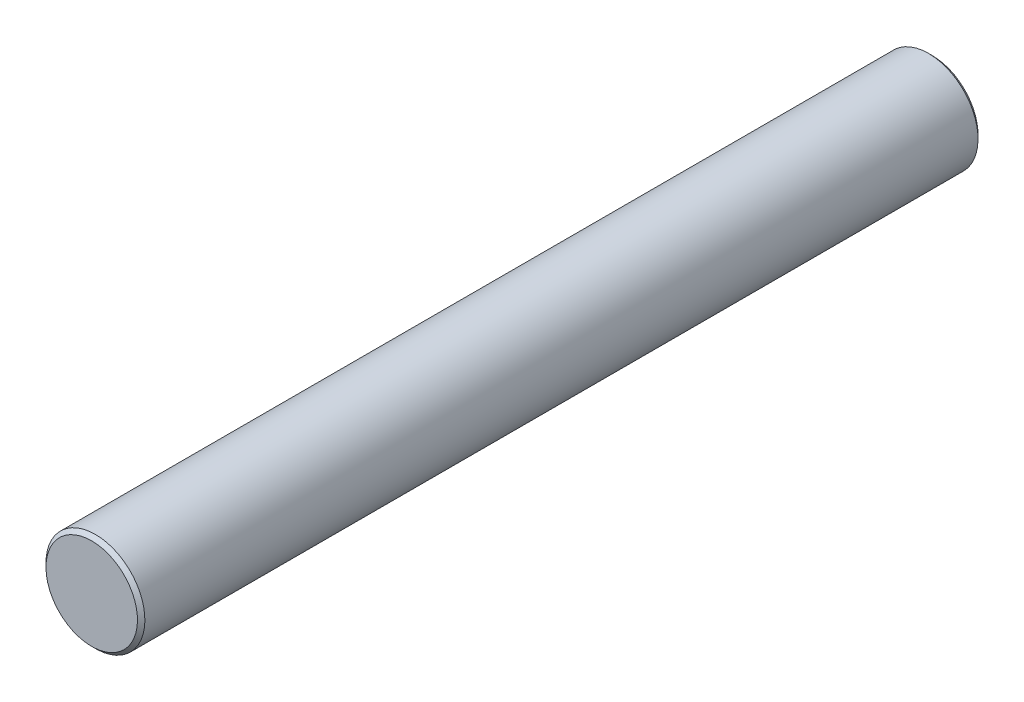
ISO-10303-21;
HEADER;
FILE_DESCRIPTION(('STEP AP214'),'2;1');
FILE_NAME('part.step','',(''),(''),'','','');
FILE_SCHEMA(('AUTOMOTIVE_DESIGN { 1 0 10303 214 1 1 1 1 }'));
ENDSEC;
DATA;
#1=APPLICATION_CONTEXT('core data for automotive mechanical design processes');
#2=APPLICATION_PROTOCOL_DEFINITION('international standard','automotive_design',2000,#1);
#3=PRODUCT_CONTEXT('',#1,'mechanical');
#4=PRODUCT('Part','Part','',(#3));
#5=PRODUCT_RELATED_PRODUCT_CATEGORY('part','',(#4));
#6=PRODUCT_DEFINITION_FORMATION('','',#4);
#7=PRODUCT_DEFINITION_CONTEXT('part definition',#1,'design');
#8=PRODUCT_DEFINITION('design','',#6,#7);
#9=PRODUCT_DEFINITION_SHAPE('','',#8);
#10=(LENGTH_UNIT() NAMED_UNIT(*) SI_UNIT(.MILLI.,.METRE.));
#11=(NAMED_UNIT(*) PLANE_ANGLE_UNIT() SI_UNIT($,.RADIAN.));
#12=(NAMED_UNIT(*) SI_UNIT($,.STERADIAN.) SOLID_ANGLE_UNIT());
#13=UNCERTAINTY_MEASURE_WITH_UNIT(LENGTH_MEASURE(1.E-05),#10,'distance_accuracy_value','');
#14=(GEOMETRIC_REPRESENTATION_CONTEXT(3) GLOBAL_UNCERTAINTY_ASSIGNED_CONTEXT((#13)) GLOBAL_UNIT_ASSIGNED_CONTEXT((#10,
#11,#12)) REPRESENTATION_CONTEXT('',''));
#15=CARTESIAN_POINT('',(0.,0.,0.));
#16=DIRECTION('',(0.,0.,1.));
#17=DIRECTION('',(1.,0.,0.));
#18=AXIS2_PLACEMENT_3D('',#15,#16,#17);
#19=CARTESIAN_POINT('',(0.,9.25,0.));
#20=DIRECTION('',(0.,0.,-1.));
#21=DIRECTION('',(0.,1.,0.));
#22=AXIS2_PLACEMENT_3D('',#19,#20,#21);
#23=PLANE('',#22);
#24=CARTESIAN_POINT('',(0.,0.,0.));
#25=DIRECTION('',(0.,0.,-1.));
#26=DIRECTION('',(0.,1.,0.));
#27=AXIS2_PLACEMENT_3D('',#24,#25,#26);
#28=CIRCLE('',#27,18.5);
#29=CARTESIAN_POINT('',(0.,18.5,0.));
#30=VERTEX_POINT('',#29);
#31=EDGE_CURVE('E9',#30,#30,#28,.T.);
#32=ORIENTED_EDGE('',*,*,#31,.T.);
#33=EDGE_LOOP('',(#32));
#34=FACE_BOUND('',#33,.T.);
#35=CARTESIAN_POINT('',(0.,0.,0.));
#36=DIRECTION('',(0.,0.,1.));
#37=DIRECTION('',(-1.,0.,0.));
#38=AXIS2_PLACEMENT_3D('',#35,#36,#37);
#39=CIRCLE('',#38,6.);
#40=CARTESIAN_POINT('',(-6.,0.,0.));
#41=VERTEX_POINT('',#40);
#42=EDGE_CURVE('E52',#41,#41,#39,.T.);
#43=ORIENTED_EDGE('',*,*,#42,.T.);
#44=EDGE_LOOP('',(#43));
#45=FACE_BOUND('',#44,.T.);
#46=ADVANCED_FACE('F15',(#34,#45),#23,.T.);
#47=CARTESIAN_POINT('',(0.,0.,0.75));
#48=DIRECTION('',(0.,0.,1.));
#49=DIRECTION('',(0.,1.,0.));
#50=AXIS2_PLACEMENT_3D('',#47,#48,#49);
#51=CONICAL_SURFACE('',#50,19.25,0.785398163397448);
#52=CARTESIAN_POINT('',(0.,0.,1.5));
#53=DIRECTION('',(0.,0.,-1.));
#54=DIRECTION('',(0.,1.,0.));
#55=AXIS2_PLACEMENT_3D('',#52,#53,#54);
#56=CIRCLE('',#55,20.);
#57=CARTESIAN_POINT('',(0.,20.,1.5));
#58=VERTEX_POINT('',#57);
#59=EDGE_CURVE('E25',#58,#58,#56,.T.);
#60=ORIENTED_EDGE('',*,*,#59,.T.);
#61=EDGE_LOOP('',(#60));
#62=FACE_BOUND('',#61,.T.);
#63=ORIENTED_EDGE('',*,*,#31,.F.);
#64=EDGE_LOOP('',(#63));
#65=FACE_BOUND('',#64,.T.);
#66=ADVANCED_FACE('F121',(#62,#65),#51,.T.);
#67=CARTESIAN_POINT('',(0.,0.,170.));
#68=DIRECTION('',(0.,0.,1.));
#69=DIRECTION('',(0.,1.,0.));
#70=AXIS2_PLACEMENT_3D('',#67,#68,#69);
#71=CYLINDRICAL_SURFACE('',#70,20.);
#72=CARTESIAN_POINT('',(0.,0.,338.5));
#73=DIRECTION('',(0.,0.,-1.));
#74=DIRECTION('',(0.,1.,0.));
#75=AXIS2_PLACEMENT_3D('',#72,#73,#74);
#76=CIRCLE('',#75,20.);
#77=CARTESIAN_POINT('',(0.,20.,338.5));
#78=VERTEX_POINT('',#77);
#79=EDGE_CURVE('E19',#78,#78,#76,.T.);
#80=ORIENTED_EDGE('',*,*,#79,.T.);
#81=EDGE_LOOP('',(#80));
#82=FACE_BOUND('',#81,.T.);
#83=ORIENTED_EDGE('',*,*,#59,.F.);
#84=EDGE_LOOP('',(#83));
#85=FACE_BOUND('',#84,.T.);
#86=CARTESIAN_POINT('',(0.,0.,6.5));
#87=DIRECTION('',(0.,0.,-1.));
#88=DIRECTION('',(0.,1.,0.));
#89=AXIS2_PLACEMENT_3D('',#86,#87,#88);
#90=CIRCLE('',#89,20.);
#91=CARTESIAN_POINT('',(10.5356537528527,-17.,6.5));
#92=VERTEX_POINT('',#91);
#93=CARTESIAN_POINT('',(-10.5356537528527,-17.,6.5));
#94=VERTEX_POINT('',#93);
#95=EDGE_CURVE('E69',#92,#94,#90,.T.);
#96=ORIENTED_EDGE('',*,*,#95,.T.);
#97=DIRECTION('',(0.,0.,1.));
#98=VECTOR('',#97,1.);
#99=CARTESIAN_POINT('',(-10.5356537528527,-17.,8.25));
#100=LINE('',#99,#98);
#101=CARTESIAN_POINT('',(-10.5356537528527,-17.,10.));
#102=VERTEX_POINT('',#101);
#103=EDGE_CURVE('E62',#94,#102,#100,.T.);
#104=ORIENTED_EDGE('',*,*,#103,.T.);
#105=CARTESIAN_POINT('',(0.,0.,10.));
#106=DIRECTION('',(0.,0.,1.));
#107=DIRECTION('',(0.,1.,0.));
#108=AXIS2_PLACEMENT_3D('',#105,#106,#107);
#109=CIRCLE('',#108,20.);
#110=CARTESIAN_POINT('',(10.5356537528527,-17.,10.));
#111=VERTEX_POINT('',#110);
#112=EDGE_CURVE('E75',#102,#111,#109,.T.);
#113=ORIENTED_EDGE('',*,*,#112,.T.);
#114=DIRECTION('',(0.,0.,-1.));
#115=VECTOR('',#114,1.);
#116=CARTESIAN_POINT('',(10.5356537528527,-17.,8.25));
#117=LINE('',#116,#115);
#118=EDGE_CURVE('E60',#111,#92,#117,.T.);
#119=ORIENTED_EDGE('',*,*,#118,.T.);
#120=EDGE_LOOP('',(#96,#104,#113,#119));
#121=FACE_BOUND('',#120,.T.);
#122=ADVANCED_FACE('F17',(#82,#85,#121),#71,.T.);
#123=CARTESIAN_POINT('',(0.,0.,339.25));
#124=DIRECTION('',(0.,0.,-1.));
#125=DIRECTION('',(0.,1.,0.));
#126=AXIS2_PLACEMENT_3D('',#123,#124,#125);
#127=CONICAL_SURFACE('',#126,19.25,0.785398163397448);
#128=CARTESIAN_POINT('',(0.,0.,340.));
#129=DIRECTION('',(0.,0.,-1.));
#130=DIRECTION('',(0.,1.,0.));
#131=AXIS2_PLACEMENT_3D('',#128,#129,#130);
#132=CIRCLE('',#131,18.5);
#133=CARTESIAN_POINT('',(0.,18.5,340.));
#134=VERTEX_POINT('',#133);
#135=EDGE_CURVE('E44',#134,#134,#132,.T.);
#136=ORIENTED_EDGE('',*,*,#135,.T.);
#137=EDGE_LOOP('',(#136));
#138=FACE_BOUND('',#137,.T.);
#139=ORIENTED_EDGE('',*,*,#79,.F.);
#140=EDGE_LOOP('',(#139));
#141=FACE_BOUND('',#140,.T.);
#142=ADVANCED_FACE('F116',(#138,#141),#127,.T.);
#143=CARTESIAN_POINT('',(0.,9.25,340.));
#144=DIRECTION('',(0.,0.,1.));
#145=DIRECTION('',(0.,-1.,0.));
#146=AXIS2_PLACEMENT_3D('',#143,#144,#145);
#147=PLANE('',#146);
#148=ORIENTED_EDGE('',*,*,#135,.F.);
#149=EDGE_LOOP('',(#148));
#150=FACE_BOUND('',#149,.T.);
#151=ADVANCED_FACE('F110',(#150),#147,.T.);
#152=CARTESIAN_POINT('',(0.,0.,26.4586213285198));
#153=DIRECTION('',(0.,0.,-1.));
#154=DIRECTION('',(-1.,0.,0.));
#155=AXIS2_PLACEMENT_3D('',#152,#153,#154);
#156=CONICAL_SURFACE('',#155,2.52640625,1.0471975511966);
#157=CARTESIAN_POINT('',(0.,0.,25.));
#158=DIRECTION('',(0.,0.,1.));
#159=DIRECTION('',(-1.,0.,0.));
#160=AXIS2_PLACEMENT_3D('',#157,#158,#159);
#161=CIRCLE('',#160,5.0528125);
#162=CARTESIAN_POINT('',(-5.0528125,0.,25.));
#163=VERTEX_POINT('',#162);
#164=EDGE_CURVE('E51',#163,#163,#161,.T.);
#165=ORIENTED_EDGE('',*,*,#164,.F.);
#166=EDGE_LOOP('',(#165));
#167=FACE_BOUND('',#166,.T.);
#168=CARTESIAN_POINT('',(0.,0.,27.9172426570397));
#169=VERTEX_POINT('',#168);
#170=VERTEX_LOOP('',#169);
#171=FACE_BOUND('',#170,.T.);
#172=ADVANCED_FACE('F104',(#167,#171),#156,.F.);
#173=CARTESIAN_POINT('',(0.,0.,12.97359375));
#174=DIRECTION('',(0.,0.,-1.));
#175=DIRECTION('',(-1.,0.,0.));
#176=AXIS2_PLACEMENT_3D('',#173,#174,#175);
#177=CYLINDRICAL_SURFACE('',#176,5.0528125);
#178=CARTESIAN_POINT('',(0.,0.,0.9471875));
#179=DIRECTION('',(0.,0.,1.));
#180=DIRECTION('',(-1.,0.,0.));
#181=AXIS2_PLACEMENT_3D('',#178,#179,#180);
#182=CIRCLE('',#181,5.0528125);
#183=CARTESIAN_POINT('',(-5.0528125,0.,0.9471875));
#184=VERTEX_POINT('',#183);
#185=EDGE_CURVE('E57',#184,#184,#182,.T.);
#186=ORIENTED_EDGE('',*,*,#185,.F.);
#187=EDGE_LOOP('',(#186));
#188=FACE_BOUND('',#187,.T.);
#189=ORIENTED_EDGE('',*,*,#164,.T.);
#190=EDGE_LOOP('',(#189));
#191=FACE_BOUND('',#190,.T.);
#192=ADVANCED_FACE('F101',(#188,#191),#177,.F.);
#193=CARTESIAN_POINT('',(0.,0.,0.47359375));
#194=DIRECTION('',(0.,0.,-1.));
#195=DIRECTION('',(-1.,0.,0.));
#196=AXIS2_PLACEMENT_3D('',#193,#194,#195);
#197=CONICAL_SURFACE('',#196,5.52640625,0.785398163397448);
#198=ORIENTED_EDGE('',*,*,#42,.F.);
#199=EDGE_LOOP('',(#198));
#200=FACE_BOUND('',#199,.T.);
#201=ORIENTED_EDGE('',*,*,#185,.T.);
#202=EDGE_LOOP('',(#201));
#203=FACE_BOUND('',#202,.T.);
#204=ADVANCED_FACE('F99',(#200,#203),#197,.F.);
#205=CARTESIAN_POINT('',(0.,-17.,8.25));
#206=DIRECTION('',(0.,-1.,0.));
#207=DIRECTION('',(0.,0.,-1.));
#208=AXIS2_PLACEMENT_3D('',#205,#206,#207);
#209=PLANE('',#208);
#210=ORIENTED_EDGE('',*,*,#103,.F.);
#211=DIRECTION('',(1.,0.,0.));
#212=VECTOR('',#211,1.);
#213=CARTESIAN_POINT('',(0.,-17.,6.5));
#214=LINE('',#213,#212);
#215=EDGE_CURVE('E66',#94,#92,#214,.T.);
#216=ORIENTED_EDGE('',*,*,#215,.T.);
#217=ORIENTED_EDGE('',*,*,#118,.F.);
#218=DIRECTION('',(-1.,0.,0.));
#219=VECTOR('',#218,1.);
#220=CARTESIAN_POINT('',(0.,-17.,10.));
#221=LINE('',#220,#219);
#222=EDGE_CURVE('E72',#111,#102,#221,.T.);
#223=ORIENTED_EDGE('',*,*,#222,.T.);
#224=EDGE_LOOP('',(#210,#216,#217,#223));
#225=FACE_BOUND('',#224,.T.);
#226=ADVANCED_FACE('F131',(#225),#209,.T.);
#227=CARTESIAN_POINT('',(0.,-19.5,6.5));
#228=DIRECTION('',(0.,0.,1.));
#229=DIRECTION('',(1.,0.,0.));
#230=AXIS2_PLACEMENT_3D('',#227,#228,#229);
#231=PLANE('',#230);
#232=ORIENTED_EDGE('',*,*,#95,.F.);
#233=ORIENTED_EDGE('',*,*,#215,.F.);
#234=EDGE_LOOP('',(#232,#233));
#235=FACE_BOUND('',#234,.T.);
#236=ADVANCED_FACE('F135',(#235),#231,.T.);
#237=CARTESIAN_POINT('',(0.,-19.5,10.));
#238=DIRECTION('',(0.,0.,1.));
#239=DIRECTION('',(1.,0.,0.));
#240=AXIS2_PLACEMENT_3D('',#237,#238,#239);
#241=PLANE('',#240);
#242=ORIENTED_EDGE('',*,*,#112,.F.);
#243=ORIENTED_EDGE('',*,*,#222,.F.);
#244=EDGE_LOOP('',(#242,#243));
#245=FACE_BOUND('',#244,.T.);
#246=ADVANCED_FACE('F87',(#245),#241,.F.);
#247=CLOSED_SHELL('',(#46,#66,#122,#142,#151,#172,#192,#204,#226,#236,#246));
#248=MANIFOLD_SOLID_BREP('B1',#247);
#249=ADVANCED_BREP_SHAPE_REPRESENTATION('',(#18,#248),#14);
#250=SHAPE_DEFINITION_REPRESENTATION(#9,#249);
ENDSEC;
END-ISO-10303-21;
